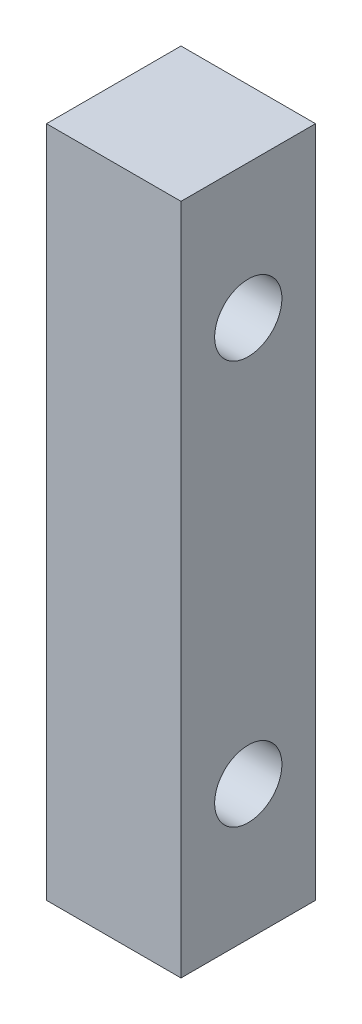
ISO-10303-21;
HEADER;
FILE_DESCRIPTION(('STEP AP214'),'2;1');
FILE_NAME('part.step','',(''),(''),'','','');
FILE_SCHEMA(('AUTOMOTIVE_DESIGN { 1 0 10303 214 1 1 1 1 }'));
ENDSEC;
DATA;
#1=APPLICATION_CONTEXT('core data for automotive mechanical design processes');
#2=APPLICATION_PROTOCOL_DEFINITION('international standard','automotive_design',2000,#1);
#3=PRODUCT_CONTEXT('',#1,'mechanical');
#4=PRODUCT('Part','Part','',(#3));
#5=PRODUCT_RELATED_PRODUCT_CATEGORY('part','',(#4));
#6=PRODUCT_DEFINITION_FORMATION('','',#4);
#7=PRODUCT_DEFINITION_CONTEXT('part definition',#1,'design');
#8=PRODUCT_DEFINITION('design','',#6,#7);
#9=PRODUCT_DEFINITION_SHAPE('','',#8);
#10=(LENGTH_UNIT() NAMED_UNIT(*) SI_UNIT(.MILLI.,.METRE.));
#11=(NAMED_UNIT(*) PLANE_ANGLE_UNIT() SI_UNIT($,.RADIAN.));
#12=(NAMED_UNIT(*) SI_UNIT($,.STERADIAN.) SOLID_ANGLE_UNIT());
#13=UNCERTAINTY_MEASURE_WITH_UNIT(LENGTH_MEASURE(1.E-05),#10,'distance_accuracy_value','');
#14=(GEOMETRIC_REPRESENTATION_CONTEXT(3) GLOBAL_UNCERTAINTY_ASSIGNED_CONTEXT((#13)) GLOBAL_UNIT_ASSIGNED_CONTEXT((#10,
#11,#12)) REPRESENTATION_CONTEXT('',''));
#15=CARTESIAN_POINT('',(0.,0.,0.));
#16=DIRECTION('',(0.,0.,1.));
#17=DIRECTION('',(1.,0.,0.));
#18=AXIS2_PLACEMENT_3D('',#15,#16,#17);
#19=CARTESIAN_POINT('',(-10.,-25.,5.));
#20=DIRECTION('',(0.,-1.,0.));
#21=DIRECTION('',(0.,0.,-1.));
#22=AXIS2_PLACEMENT_3D('',#19,#20,#21);
#23=PLANE('',#22);
#24=DIRECTION('',(0.,0.,-1.));
#25=VECTOR('',#24,1.);
#26=CARTESIAN_POINT('',(0.,-25.,5.));
#27=LINE('',#26,#25);
#28=CARTESIAN_POINT('',(0.,-25.,5.));
#29=VERTEX_POINT('',#28);
#30=CARTESIAN_POINT('',(0.,-25.,-5.));
#31=VERTEX_POINT('',#30);
#32=EDGE_CURVE('E90',#29,#31,#27,.T.);
#33=ORIENTED_EDGE('',*,*,#32,.F.);
#34=DIRECTION('',(1.,0.,0.));
#35=VECTOR('',#34,1.);
#36=CARTESIAN_POINT('',(-10.,-25.,5.));
#37=LINE('',#36,#35);
#38=CARTESIAN_POINT('',(-10.,-25.,5.));
#39=VERTEX_POINT('',#38);
#40=EDGE_CURVE('E32',#39,#29,#37,.T.);
#41=ORIENTED_EDGE('',*,*,#40,.F.);
#42=DIRECTION('',(0.,0.,-1.));
#43=VECTOR('',#42,1.);
#44=CARTESIAN_POINT('',(-10.,-25.,5.));
#45=LINE('',#44,#43);
#46=CARTESIAN_POINT('',(-10.,-25.,-5.));
#47=VERTEX_POINT('',#46);
#48=EDGE_CURVE('E71',#39,#47,#45,.T.);
#49=ORIENTED_EDGE('',*,*,#48,.T.);
#50=DIRECTION('',(1.,0.,0.));
#51=VECTOR('',#50,1.);
#52=CARTESIAN_POINT('',(-10.,-25.,-5.));
#53=LINE('',#52,#51);
#54=EDGE_CURVE('E10',#47,#31,#53,.T.);
#55=ORIENTED_EDGE('',*,*,#54,.T.);
#56=EDGE_LOOP('',(#33,#41,#49,#55));
#57=FACE_BOUND('',#56,.T.);
#58=ADVANCED_FACE('F16',(#57),#23,.T.);
#59=CARTESIAN_POINT('',(-10.,-25.,-5.));
#60=DIRECTION('',(0.,0.,-1.));
#61=DIRECTION('',(0.,1.,0.));
#62=AXIS2_PLACEMENT_3D('',#59,#60,#61);
#63=PLANE('',#62);
#64=DIRECTION('',(0.,1.,0.));
#65=VECTOR('',#64,1.);
#66=CARTESIAN_POINT('',(0.,-25.,-5.));
#67=LINE('',#66,#65);
#68=CARTESIAN_POINT('',(0.,25.,-4.99999999999999));
#69=VERTEX_POINT('',#68);
#70=EDGE_CURVE('E87',#31,#69,#67,.T.);
#71=ORIENTED_EDGE('',*,*,#70,.F.);
#72=ORIENTED_EDGE('',*,*,#54,.F.);
#73=DIRECTION('',(0.,1.,0.));
#74=VECTOR('',#73,1.);
#75=CARTESIAN_POINT('',(-10.,-25.,-5.));
#76=LINE('',#75,#74);
#77=CARTESIAN_POINT('',(-10.,25.,-4.99999999999999));
#78=VERTEX_POINT('',#77);
#79=EDGE_CURVE('E67',#47,#78,#76,.T.);
#80=ORIENTED_EDGE('',*,*,#79,.T.);
#81=DIRECTION('',(1.,0.,0.));
#82=VECTOR('',#81,1.);
#83=CARTESIAN_POINT('',(-10.,25.,-4.99999999999999));
#84=LINE('',#83,#82);
#85=EDGE_CURVE('E24',#78,#69,#84,.T.);
#86=ORIENTED_EDGE('',*,*,#85,.T.);
#87=EDGE_LOOP('',(#71,#72,#80,#86));
#88=FACE_BOUND('',#87,.T.);
#89=ADVANCED_FACE('F68',(#88),#63,.T.);
#90=CARTESIAN_POINT('',(-10.,25.,-4.99999999999999));
#91=DIRECTION('',(0.,1.,0.));
#92=DIRECTION('',(0.,0.,1.));
#93=AXIS2_PLACEMENT_3D('',#90,#91,#92);
#94=PLANE('',#93);
#95=DIRECTION('',(0.,0.,1.));
#96=VECTOR('',#95,1.);
#97=CARTESIAN_POINT('',(0.,25.,-4.99999999999999));
#98=LINE('',#97,#96);
#99=CARTESIAN_POINT('',(0.,25.,5.));
#100=VERTEX_POINT('',#99);
#101=EDGE_CURVE('E65',#69,#100,#98,.T.);
#102=ORIENTED_EDGE('',*,*,#101,.F.);
#103=ORIENTED_EDGE('',*,*,#85,.F.);
#104=DIRECTION('',(0.,0.,1.));
#105=VECTOR('',#104,1.);
#106=CARTESIAN_POINT('',(-10.,25.,-4.99999999999999));
#107=LINE('',#106,#105);
#108=CARTESIAN_POINT('',(-10.,25.,5.));
#109=VERTEX_POINT('',#108);
#110=EDGE_CURVE('E62',#78,#109,#107,.T.);
#111=ORIENTED_EDGE('',*,*,#110,.T.);
#112=DIRECTION('',(1.,0.,0.));
#113=VECTOR('',#112,1.);
#114=CARTESIAN_POINT('',(-10.,25.,5.));
#115=LINE('',#114,#113);
#116=EDGE_CURVE('E48',#109,#100,#115,.T.);
#117=ORIENTED_EDGE('',*,*,#116,.T.);
#118=EDGE_LOOP('',(#102,#103,#111,#117));
#119=FACE_BOUND('',#118,.T.);
#120=ADVANCED_FACE('F60',(#119),#94,.T.);
#121=CARTESIAN_POINT('',(-10.,25.,5.));
#122=DIRECTION('',(0.,0.,1.));
#123=DIRECTION('',(1.,0.,0.));
#124=AXIS2_PLACEMENT_3D('',#121,#122,#123);
#125=PLANE('',#124);
#126=DIRECTION('',(0.,-1.,0.));
#127=VECTOR('',#126,1.);
#128=CARTESIAN_POINT('',(0.,25.,5.));
#129=LINE('',#128,#127);
#130=EDGE_CURVE('E93',#100,#29,#129,.T.);
#131=ORIENTED_EDGE('',*,*,#130,.F.);
#132=ORIENTED_EDGE('',*,*,#116,.F.);
#133=DIRECTION('',(0.,-1.,0.));
#134=VECTOR('',#133,1.);
#135=CARTESIAN_POINT('',(-10.,25.,5.));
#136=LINE('',#135,#134);
#137=EDGE_CURVE('E75',#109,#39,#136,.T.);
#138=ORIENTED_EDGE('',*,*,#137,.T.);
#139=ORIENTED_EDGE('',*,*,#40,.T.);
#140=EDGE_LOOP('',(#131,#132,#138,#139));
#141=FACE_BOUND('',#140,.T.);
#142=ADVANCED_FACE('F125',(#141),#125,.T.);
#143=CARTESIAN_POINT('',(-10.,-15.,0.));
#144=DIRECTION('',(1.,0.,0.));
#145=DIRECTION('',(0.,0.,-1.));
#146=AXIS2_PLACEMENT_3D('',#143,#144,#145);
#147=CYLINDRICAL_SURFACE('',#146,2.5);
#148=CARTESIAN_POINT('',(-10.,-15.,0.));
#149=DIRECTION('',(-1.,0.,0.));
#150=DIRECTION('',(0.,1.,0.));
#151=AXIS2_PLACEMENT_3D('',#148,#149,#150);
#152=CIRCLE('',#151,2.5);
#153=CARTESIAN_POINT('',(-10.,-12.5,0.));
#154=VERTEX_POINT('',#153);
#155=EDGE_CURVE('E77',#154,#154,#152,.T.);
#156=ORIENTED_EDGE('',*,*,#155,.T.);
#157=EDGE_LOOP('',(#156));
#158=FACE_BOUND('',#157,.T.);
#159=CARTESIAN_POINT('',(0.,-15.,0.));
#160=DIRECTION('',(-1.,0.,0.));
#161=DIRECTION('',(0.,1.,0.));
#162=AXIS2_PLACEMENT_3D('',#159,#160,#161);
#163=CIRCLE('',#162,2.5);
#164=CARTESIAN_POINT('',(0.,-12.5,0.));
#165=VERTEX_POINT('',#164);
#166=EDGE_CURVE('E96',#165,#165,#163,.T.);
#167=ORIENTED_EDGE('',*,*,#166,.F.);
#168=EDGE_LOOP('',(#167));
#169=FACE_BOUND('',#168,.T.);
#170=ADVANCED_FACE('F115',(#158,#169),#147,.F.);
#171=CARTESIAN_POINT('',(-10.,15.,0.));
#172=DIRECTION('',(1.,0.,0.));
#173=DIRECTION('',(0.,0.,-1.));
#174=AXIS2_PLACEMENT_3D('',#171,#172,#173);
#175=CYLINDRICAL_SURFACE('',#174,2.5);
#176=CARTESIAN_POINT('',(-10.,15.,0.));
#177=DIRECTION('',(-1.,0.,0.));
#178=DIRECTION('',(0.,1.,0.));
#179=AXIS2_PLACEMENT_3D('',#176,#177,#178);
#180=CIRCLE('',#179,2.5);
#181=CARTESIAN_POINT('',(-10.,17.5,0.));
#182=VERTEX_POINT('',#181);
#183=EDGE_CURVE('E84',#182,#182,#180,.T.);
#184=ORIENTED_EDGE('',*,*,#183,.T.);
#185=EDGE_LOOP('',(#184));
#186=FACE_BOUND('',#185,.T.);
#187=CARTESIAN_POINT('',(0.,15.,0.));
#188=DIRECTION('',(-1.,0.,0.));
#189=DIRECTION('',(0.,1.,0.));
#190=AXIS2_PLACEMENT_3D('',#187,#188,#189);
#191=CIRCLE('',#190,2.5);
#192=CARTESIAN_POINT('',(0.,17.5,0.));
#193=VERTEX_POINT('',#192);
#194=EDGE_CURVE('E81',#193,#193,#191,.T.);
#195=ORIENTED_EDGE('',*,*,#194,.F.);
#196=EDGE_LOOP('',(#195));
#197=FACE_BOUND('',#196,.T.);
#198=ADVANCED_FACE('F113',(#186,#197),#175,.F.);
#199=CARTESIAN_POINT('',(-10.,0.,0.));
#200=DIRECTION('',(1.,0.,0.));
#201=DIRECTION('',(0.,1.,0.));
#202=AXIS2_PLACEMENT_3D('',#199,#200,#201);
#203=PLANE('',#202);
#204=ORIENTED_EDGE('',*,*,#155,.F.);
#205=EDGE_LOOP('',(#204));
#206=FACE_BOUND('',#205,.T.);
#207=ORIENTED_EDGE('',*,*,#48,.F.);
#208=ORIENTED_EDGE('',*,*,#137,.F.);
#209=ORIENTED_EDGE('',*,*,#110,.F.);
#210=ORIENTED_EDGE('',*,*,#79,.F.);
#211=EDGE_LOOP('',(#207,#208,#209,#210));
#212=FACE_BOUND('',#211,.T.);
#213=ORIENTED_EDGE('',*,*,#183,.F.);
#214=EDGE_LOOP('',(#213));
#215=FACE_BOUND('',#214,.T.);
#216=ADVANCED_FACE('F73',(#206,#212,#215),#203,.F.);
#217=CARTESIAN_POINT('',(0.,0.,0.));
#218=DIRECTION('',(1.,0.,0.));
#219=DIRECTION('',(0.,1.,0.));
#220=AXIS2_PLACEMENT_3D('',#217,#218,#219);
#221=PLANE('',#220);
#222=ORIENTED_EDGE('',*,*,#166,.T.);
#223=EDGE_LOOP('',(#222));
#224=FACE_BOUND('',#223,.T.);
#225=ORIENTED_EDGE('',*,*,#32,.T.);
#226=ORIENTED_EDGE('',*,*,#70,.T.);
#227=ORIENTED_EDGE('',*,*,#101,.T.);
#228=ORIENTED_EDGE('',*,*,#130,.T.);
#229=EDGE_LOOP('',(#225,#226,#227,#228));
#230=FACE_BOUND('',#229,.T.);
#231=ORIENTED_EDGE('',*,*,#194,.T.);
#232=EDGE_LOOP('',(#231));
#233=FACE_BOUND('',#232,.T.);
#234=ADVANCED_FACE('F111',(#224,#230,#233),#221,.T.);
#235=CLOSED_SHELL('',(#58,#89,#120,#142,#170,#198,#216,#234));
#236=MANIFOLD_SOLID_BREP('B1',#235);
#237=ADVANCED_BREP_SHAPE_REPRESENTATION('',(#18,#236),#14);
#238=SHAPE_DEFINITION_REPRESENTATION(#9,#237);
ENDSEC;
END-ISO-10303-21;
